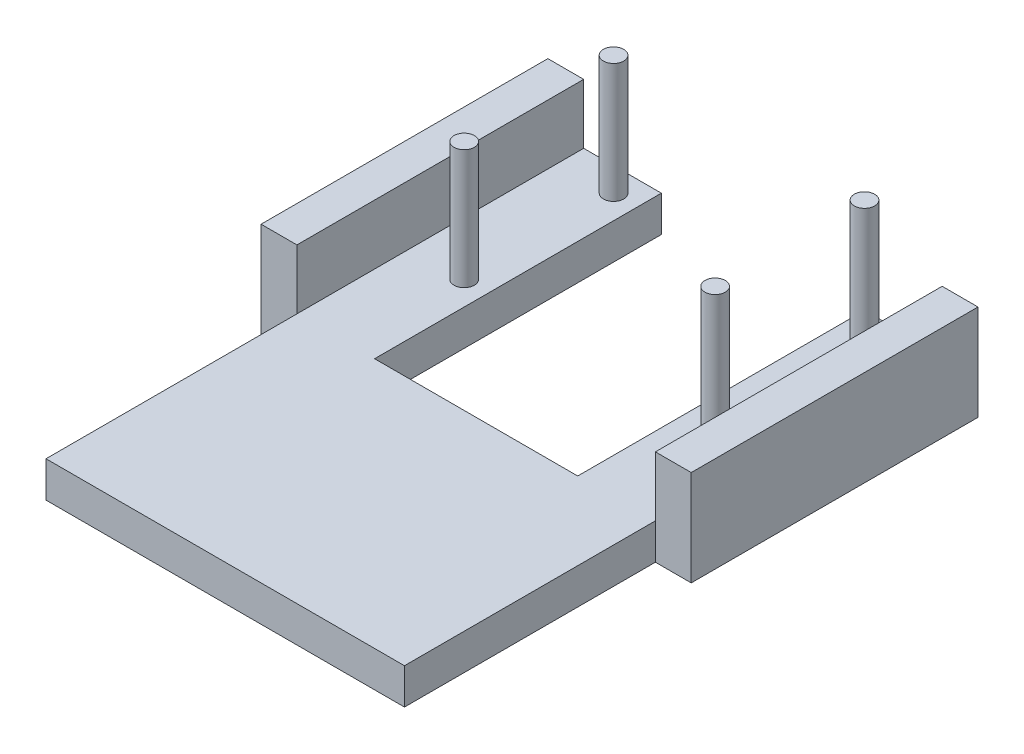
ISO-10303-21;
HEADER;
FILE_DESCRIPTION(('STEP AP214'),'2;1');
FILE_NAME('part.step','',(''),(''),'','','');
FILE_SCHEMA(('AUTOMOTIVE_DESIGN { 1 0 10303 214 1 1 1 1 }'));
ENDSEC;
DATA;
#1=APPLICATION_CONTEXT('core data for automotive mechanical design processes');
#2=APPLICATION_PROTOCOL_DEFINITION('international standard','automotive_design',2000,#1);
#3=PRODUCT_CONTEXT('',#1,'mechanical');
#4=PRODUCT('Part','Part','',(#3));
#5=PRODUCT_RELATED_PRODUCT_CATEGORY('part','',(#4));
#6=PRODUCT_DEFINITION_FORMATION('','',#4);
#7=PRODUCT_DEFINITION_CONTEXT('part definition',#1,'design');
#8=PRODUCT_DEFINITION('design','',#6,#7);
#9=PRODUCT_DEFINITION_SHAPE('','',#8);
#10=(LENGTH_UNIT() NAMED_UNIT(*) SI_UNIT(.MILLI.,.METRE.));
#11=(NAMED_UNIT(*) PLANE_ANGLE_UNIT() SI_UNIT($,.RADIAN.));
#12=(NAMED_UNIT(*) SI_UNIT($,.STERADIAN.) SOLID_ANGLE_UNIT());
#13=UNCERTAINTY_MEASURE_WITH_UNIT(LENGTH_MEASURE(1.E-05),#10,'distance_accuracy_value','');
#14=(GEOMETRIC_REPRESENTATION_CONTEXT(3) GLOBAL_UNCERTAINTY_ASSIGNED_CONTEXT((#13)) GLOBAL_UNIT_ASSIGNED_CONTEXT((#10,
#11,#12)) REPRESENTATION_CONTEXT('',''));
#15=CARTESIAN_POINT('',(0.,0.,0.));
#16=DIRECTION('',(0.,0.,1.));
#17=DIRECTION('',(1.,0.,0.));
#18=AXIS2_PLACEMENT_3D('',#15,#16,#17);
#19=CARTESIAN_POINT('',(0.,3.,0.));
#20=DIRECTION('',(0.,-1.,0.));
#21=DIRECTION('',(0.,0.,-1.));
#22=AXIS2_PLACEMENT_3D('',#19,#20,#21);
#23=PLANE('',#22);
#24=CARTESIAN_POINT('',(4.5,3.,-30.5));
#25=DIRECTION('',(0.,-1.,0.));
#26=DIRECTION('',(0.,0.,-1.));
#27=AXIS2_PLACEMENT_3D('',#24,#25,#26);
#28=CIRCLE('',#27,0.85);
#29=CARTESIAN_POINT('',(4.5,3.,-31.35));
#30=VERTEX_POINT('',#29);
#31=EDGE_CURVE('E11',#30,#30,#28,.F.);
#32=ORIENTED_EDGE('',*,*,#31,.F.);
#33=EDGE_LOOP('',(#32));
#34=FACE_BOUND('',#33,.T.);
#35=CARTESIAN_POINT('',(25.5,3.,-30.5));
#36=DIRECTION('',(0.,-1.,0.));
#37=DIRECTION('',(0.,0.,-1.));
#38=AXIS2_PLACEMENT_3D('',#35,#36,#37);
#39=CIRCLE('',#38,0.85);
#40=CARTESIAN_POINT('',(25.5,3.,-31.35));
#41=VERTEX_POINT('',#40);
#42=EDGE_CURVE('E41',#41,#41,#39,.F.);
#43=ORIENTED_EDGE('',*,*,#42,.F.);
#44=EDGE_LOOP('',(#43));
#45=FACE_BOUND('',#44,.T.);
#46=CARTESIAN_POINT('',(25.5,3.,-43.));
#47=DIRECTION('',(0.,-1.,0.));
#48=DIRECTION('',(0.,0.,-1.));
#49=AXIS2_PLACEMENT_3D('',#46,#47,#48);
#50=CIRCLE('',#49,0.850000000000001);
#51=CARTESIAN_POINT('',(25.5,3.,-43.85));
#52=VERTEX_POINT('',#51);
#53=EDGE_CURVE('E205',#52,#52,#50,.F.);
#54=ORIENTED_EDGE('',*,*,#53,.F.);
#55=EDGE_LOOP('',(#54));
#56=FACE_BOUND('',#55,.T.);
#57=CARTESIAN_POINT('',(4.5,3.,-43.));
#58=DIRECTION('',(0.,-1.,0.));
#59=DIRECTION('',(0.,0.,-1.));
#60=AXIS2_PLACEMENT_3D('',#57,#58,#59);
#61=CIRCLE('',#60,0.850000000000002);
#62=CARTESIAN_POINT('',(4.5,3.,-43.85));
#63=VERTEX_POINT('',#62);
#64=EDGE_CURVE('E202',#63,#63,#61,.F.);
#65=ORIENTED_EDGE('',*,*,#64,.F.);
#66=EDGE_LOOP('',(#65));
#67=FACE_BOUND('',#66,.T.);
#68=DIRECTION('',(0.,0.,1.));
#69=VECTOR('',#68,1.);
#70=CARTESIAN_POINT('',(30.,3.,-45.));
#71=LINE('',#70,#69);
#72=CARTESIAN_POINT('',(30.,3.,-45.));
#73=VERTEX_POINT('',#72);
#74=CARTESIAN_POINT('',(30.,3.,-21.));
#75=VERTEX_POINT('',#74);
#76=EDGE_CURVE('E231',#73,#75,#71,.T.);
#77=ORIENTED_EDGE('',*,*,#76,.F.);
#78=DIRECTION('',(-1.,0.,0.));
#79=VECTOR('',#78,1.);
#80=CARTESIAN_POINT('',(23.5,3.,-45.));
#81=LINE('',#80,#79);
#82=CARTESIAN_POINT('',(23.5,3.,-45.));
#83=VERTEX_POINT('',#82);
#84=EDGE_CURVE('E281',#73,#83,#81,.T.);
#85=ORIENTED_EDGE('',*,*,#84,.T.);
#86=DIRECTION('',(0.,0.,1.));
#87=VECTOR('',#86,1.);
#88=CARTESIAN_POINT('',(23.5,3.,-21.));
#89=LINE('',#88,#87);
#90=CARTESIAN_POINT('',(23.5,3.,-21.));
#91=VERTEX_POINT('',#90);
#92=EDGE_CURVE('E130',#83,#91,#89,.T.);
#93=ORIENTED_EDGE('',*,*,#92,.T.);
#94=DIRECTION('',(-1.,0.,0.));
#95=VECTOR('',#94,1.);
#96=CARTESIAN_POINT('',(6.5,3.,-21.));
#97=LINE('',#96,#95);
#98=CARTESIAN_POINT('',(6.5,3.,-21.));
#99=VERTEX_POINT('',#98);
#100=EDGE_CURVE('E123',#91,#99,#97,.T.);
#101=ORIENTED_EDGE('',*,*,#100,.T.);
#102=DIRECTION('',(0.,0.,-1.));
#103=VECTOR('',#102,1.);
#104=CARTESIAN_POINT('',(6.5,3.,-45.));
#105=LINE('',#104,#103);
#106=CARTESIAN_POINT('',(6.5,3.,-45.));
#107=VERTEX_POINT('',#106);
#108=EDGE_CURVE('E127',#99,#107,#105,.T.);
#109=ORIENTED_EDGE('',*,*,#108,.T.);
#110=DIRECTION('',(-1.,0.,0.));
#111=VECTOR('',#110,1.);
#112=CARTESIAN_POINT('',(-3.,3.,-45.));
#113=LINE('',#112,#111);
#114=CARTESIAN_POINT('',(0.,3.,-45.));
#115=VERTEX_POINT('',#114);
#116=EDGE_CURVE('E148',#107,#115,#113,.T.);
#117=ORIENTED_EDGE('',*,*,#116,.T.);
#118=DIRECTION('',(0.,0.,-1.));
#119=VECTOR('',#118,1.);
#120=CARTESIAN_POINT('',(0.,3.,-21.));
#121=LINE('',#120,#119);
#122=CARTESIAN_POINT('',(0.,3.,-21.));
#123=VERTEX_POINT('',#122);
#124=EDGE_CURVE('E49',#123,#115,#121,.T.);
#125=ORIENTED_EDGE('',*,*,#124,.F.);
#126=DIRECTION('',(0.,0.,1.));
#127=VECTOR('',#126,1.);
#128=CARTESIAN_POINT('',(0.,3.,-21.));
#129=LINE('',#128,#127);
#130=CARTESIAN_POINT('',(0.,3.,0.));
#131=VERTEX_POINT('',#130);
#132=EDGE_CURVE('E177',#123,#131,#129,.T.);
#133=ORIENTED_EDGE('',*,*,#132,.T.);
#134=DIRECTION('',(1.,0.,0.));
#135=VECTOR('',#134,1.);
#136=CARTESIAN_POINT('',(30.,3.,0.));
#137=LINE('',#136,#135);
#138=CARTESIAN_POINT('',(30.,3.,0.));
#139=VERTEX_POINT('',#138);
#140=EDGE_CURVE('E107',#131,#139,#137,.T.);
#141=ORIENTED_EDGE('',*,*,#140,.T.);
#142=DIRECTION('',(0.,0.,-1.));
#143=VECTOR('',#142,1.);
#144=CARTESIAN_POINT('',(30.,3.,0.));
#145=LINE('',#144,#143);
#146=EDGE_CURVE('E279',#139,#75,#145,.T.);
#147=ORIENTED_EDGE('',*,*,#146,.T.);
#148=EDGE_LOOP('',(#77,#85,#93,#101,#109,#117,#125,#133,#141,#147));
#149=FACE_BOUND('',#148,.T.);
#150=ADVANCED_FACE('F32',(#34,#45,#56,#67,#149),#23,.F.);
#151=CARTESIAN_POINT('',(0.,3.,-21.));
#152=DIRECTION('',(1.,0.,0.));
#153=DIRECTION('',(0.,0.,-1.));
#154=AXIS2_PLACEMENT_3D('',#151,#152,#153);
#155=PLANE('',#154);
#156=DIRECTION('',(0.,0.,1.));
#157=VECTOR('',#156,1.);
#158=CARTESIAN_POINT('',(0.,0.,-21.));
#159=LINE('',#158,#157);
#160=CARTESIAN_POINT('',(0.,0.,-21.));
#161=VERTEX_POINT('',#160);
#162=CARTESIAN_POINT('',(0.,0.,0.));
#163=VERTEX_POINT('',#162);
#164=EDGE_CURVE('E154',#161,#163,#159,.T.);
#165=ORIENTED_EDGE('',*,*,#164,.T.);
#166=DIRECTION('',(0.,-1.,0.));
#167=VECTOR('',#166,1.);
#168=CARTESIAN_POINT('',(0.,3.,0.));
#169=LINE('',#168,#167);
#170=EDGE_CURVE('E200',#131,#163,#169,.T.);
#171=ORIENTED_EDGE('',*,*,#170,.F.);
#172=ORIENTED_EDGE('',*,*,#132,.F.);
#173=DIRECTION('',(0.,-1.,0.));
#174=VECTOR('',#173,1.);
#175=CARTESIAN_POINT('',(0.,3.,-21.));
#176=LINE('',#175,#174);
#177=EDGE_CURVE('E150',#123,#161,#176,.T.);
#178=ORIENTED_EDGE('',*,*,#177,.T.);
#179=EDGE_LOOP('',(#165,#171,#172,#178));
#180=FACE_BOUND('',#179,.T.);
#181=ADVANCED_FACE('F34',(#180),#155,.F.);
#182=CARTESIAN_POINT('',(30.,3.,0.));
#183=DIRECTION('',(0.,0.,-1.));
#184=DIRECTION('',(-1.,0.,0.));
#185=AXIS2_PLACEMENT_3D('',#182,#183,#184);
#186=PLANE('',#185);
#187=DIRECTION('',(1.,0.,0.));
#188=VECTOR('',#187,1.);
#189=CARTESIAN_POINT('',(30.,0.,0.));
#190=LINE('',#189,#188);
#191=CARTESIAN_POINT('',(30.,0.,0.));
#192=VERTEX_POINT('',#191);
#193=EDGE_CURVE('E157',#163,#192,#190,.T.);
#194=ORIENTED_EDGE('',*,*,#193,.T.);
#195=DIRECTION('',(0.,-1.,0.));
#196=VECTOR('',#195,1.);
#197=CARTESIAN_POINT('',(30.,3.,0.));
#198=LINE('',#197,#196);
#199=EDGE_CURVE('E197',#139,#192,#198,.T.);
#200=ORIENTED_EDGE('',*,*,#199,.F.);
#201=ORIENTED_EDGE('',*,*,#140,.F.);
#202=ORIENTED_EDGE('',*,*,#170,.T.);
#203=EDGE_LOOP('',(#194,#200,#201,#202));
#204=FACE_BOUND('',#203,.T.);
#205=ADVANCED_FACE('F326',(#204),#186,.F.);
#206=CARTESIAN_POINT('',(30.,3.,0.));
#207=DIRECTION('',(-1.,0.,0.));
#208=DIRECTION('',(0.,0.,1.));
#209=AXIS2_PLACEMENT_3D('',#206,#207,#208);
#210=PLANE('',#209);
#211=DIRECTION('',(0.,0.,-1.));
#212=VECTOR('',#211,1.);
#213=CARTESIAN_POINT('',(30.,0.,0.));
#214=LINE('',#213,#212);
#215=CARTESIAN_POINT('',(30.,0.,-21.));
#216=VERTEX_POINT('',#215);
#217=EDGE_CURVE('E160',#192,#216,#214,.T.);
#218=ORIENTED_EDGE('',*,*,#217,.T.);
#219=DIRECTION('',(0.,-1.,0.));
#220=VECTOR('',#219,1.);
#221=CARTESIAN_POINT('',(30.,3.,-21.));
#222=LINE('',#221,#220);
#223=EDGE_CURVE('E194',#75,#216,#222,.T.);
#224=ORIENTED_EDGE('',*,*,#223,.F.);
#225=ORIENTED_EDGE('',*,*,#146,.F.);
#226=ORIENTED_EDGE('',*,*,#199,.T.);
#227=EDGE_LOOP('',(#218,#224,#225,#226));
#228=FACE_BOUND('',#227,.T.);
#229=ADVANCED_FACE('F328',(#228),#210,.F.);
#230=CARTESIAN_POINT('',(30.,3.,-21.));
#231=DIRECTION('',(0.,0.,-1.));
#232=DIRECTION('',(-1.,0.,0.));
#233=AXIS2_PLACEMENT_3D('',#230,#231,#232);
#234=PLANE('',#233);
#235=DIRECTION('',(1.,0.,0.));
#236=VECTOR('',#235,1.);
#237=CARTESIAN_POINT('',(30.,0.,-21.));
#238=LINE('',#237,#236);
#239=CARTESIAN_POINT('',(33.,0.,-21.));
#240=VERTEX_POINT('',#239);
#241=EDGE_CURVE('E162',#216,#240,#238,.T.);
#242=ORIENTED_EDGE('',*,*,#241,.T.);
#243=DIRECTION('',(0.,-1.,0.));
#244=VECTOR('',#243,1.);
#245=CARTESIAN_POINT('',(33.,3.,-21.));
#246=LINE('',#245,#244);
#247=CARTESIAN_POINT('',(33.,8.,-21.));
#248=VERTEX_POINT('',#247);
#249=EDGE_CURVE('E191',#248,#240,#246,.T.);
#250=ORIENTED_EDGE('',*,*,#249,.F.);
#251=DIRECTION('',(1.,0.,0.));
#252=VECTOR('',#251,1.);
#253=CARTESIAN_POINT('',(30.,8.,-21.));
#254=LINE('',#253,#252);
#255=CARTESIAN_POINT('',(30.,8.,-21.));
#256=VERTEX_POINT('',#255);
#257=EDGE_CURVE('E250',#256,#248,#254,.T.);
#258=ORIENTED_EDGE('',*,*,#257,.F.);
#259=DIRECTION('',(0.,-1.,0.));
#260=VECTOR('',#259,1.);
#261=CARTESIAN_POINT('',(30.,8.,-21.));
#262=LINE('',#261,#260);
#263=EDGE_CURVE('E252',#256,#75,#262,.T.);
#264=ORIENTED_EDGE('',*,*,#263,.T.);
#265=ORIENTED_EDGE('',*,*,#223,.T.);
#266=EDGE_LOOP('',(#242,#250,#258,#264,#265));
#267=FACE_BOUND('',#266,.T.);
#268=ADVANCED_FACE('F337',(#267),#234,.F.);
#269=CARTESIAN_POINT('',(33.,3.,-21.));
#270=DIRECTION('',(-1.,0.,0.));
#271=DIRECTION('',(0.,0.,1.));
#272=AXIS2_PLACEMENT_3D('',#269,#270,#271);
#273=PLANE('',#272);
#274=DIRECTION('',(0.,0.,-1.));
#275=VECTOR('',#274,1.);
#276=CARTESIAN_POINT('',(33.,0.,-21.));
#277=LINE('',#276,#275);
#278=CARTESIAN_POINT('',(33.,0.,-45.));
#279=VERTEX_POINT('',#278);
#280=EDGE_CURVE('E164',#240,#279,#277,.T.);
#281=ORIENTED_EDGE('',*,*,#280,.T.);
#282=DIRECTION('',(0.,-1.,0.));
#283=VECTOR('',#282,1.);
#284=CARTESIAN_POINT('',(33.,3.,-45.));
#285=LINE('',#284,#283);
#286=CARTESIAN_POINT('',(33.,8.,-45.));
#287=VERTEX_POINT('',#286);
#288=EDGE_CURVE('E188',#287,#279,#285,.T.);
#289=ORIENTED_EDGE('',*,*,#288,.F.);
#290=DIRECTION('',(0.,0.,-1.));
#291=VECTOR('',#290,1.);
#292=CARTESIAN_POINT('',(33.,8.,-21.));
#293=LINE('',#292,#291);
#294=EDGE_CURVE('E235',#248,#287,#293,.T.);
#295=ORIENTED_EDGE('',*,*,#294,.F.);
#296=ORIENTED_EDGE('',*,*,#249,.T.);
#297=EDGE_LOOP('',(#281,#289,#295,#296));
#298=FACE_BOUND('',#297,.T.);
#299=ADVANCED_FACE('F346',(#298),#273,.F.);
#300=CARTESIAN_POINT('',(23.5,3.,-45.));
#301=DIRECTION('',(0.,0.,1.));
#302=DIRECTION('',(1.,0.,0.));
#303=AXIS2_PLACEMENT_3D('',#300,#301,#302);
#304=PLANE('',#303);
#305=DIRECTION('',(-1.,0.,0.));
#306=VECTOR('',#305,1.);
#307=CARTESIAN_POINT('',(23.5,0.,-45.));
#308=LINE('',#307,#306);
#309=CARTESIAN_POINT('',(23.5,0.,-45.));
#310=VERTEX_POINT('',#309);
#311=EDGE_CURVE('E166',#279,#310,#308,.T.);
#312=ORIENTED_EDGE('',*,*,#311,.T.);
#313=DIRECTION('',(0.,-1.,0.));
#314=VECTOR('',#313,1.);
#315=CARTESIAN_POINT('',(23.5,3.,-45.));
#316=LINE('',#315,#314);
#317=EDGE_CURVE('E185',#83,#310,#316,.T.);
#318=ORIENTED_EDGE('',*,*,#317,.F.);
#319=ORIENTED_EDGE('',*,*,#84,.F.);
#320=DIRECTION('',(0.,-1.,0.));
#321=VECTOR('',#320,1.);
#322=CARTESIAN_POINT('',(30.,8.,-45.));
#323=LINE('',#322,#321);
#324=CARTESIAN_POINT('',(30.,8.,-45.));
#325=VERTEX_POINT('',#324);
#326=EDGE_CURVE('E256',#325,#73,#323,.T.);
#327=ORIENTED_EDGE('',*,*,#326,.F.);
#328=DIRECTION('',(-1.,0.,0.));
#329=VECTOR('',#328,1.);
#330=CARTESIAN_POINT('',(33.,8.,-45.));
#331=LINE('',#330,#329);
#332=EDGE_CURVE('E244',#287,#325,#331,.T.);
#333=ORIENTED_EDGE('',*,*,#332,.F.);
#334=ORIENTED_EDGE('',*,*,#288,.T.);
#335=EDGE_LOOP('',(#312,#318,#319,#327,#333,#334));
#336=FACE_BOUND('',#335,.T.);
#337=ADVANCED_FACE('F287',(#336),#304,.F.);
#338=CARTESIAN_POINT('',(23.5,3.,-21.));
#339=DIRECTION('',(1.,0.,0.));
#340=DIRECTION('',(0.,0.,-1.));
#341=AXIS2_PLACEMENT_3D('',#338,#339,#340);
#342=PLANE('',#341);
#343=DIRECTION('',(0.,0.,1.));
#344=VECTOR('',#343,1.);
#345=CARTESIAN_POINT('',(23.5,0.,-21.));
#346=LINE('',#345,#344);
#347=CARTESIAN_POINT('',(23.5,0.,-21.));
#348=VERTEX_POINT('',#347);
#349=EDGE_CURVE('E168',#310,#348,#346,.T.);
#350=ORIENTED_EDGE('',*,*,#349,.T.);
#351=DIRECTION('',(0.,-1.,0.));
#352=VECTOR('',#351,1.);
#353=CARTESIAN_POINT('',(23.5,3.,-21.));
#354=LINE('',#353,#352);
#355=EDGE_CURVE('E142',#91,#348,#354,.T.);
#356=ORIENTED_EDGE('',*,*,#355,.F.);
#357=ORIENTED_EDGE('',*,*,#92,.F.);
#358=ORIENTED_EDGE('',*,*,#317,.T.);
#359=EDGE_LOOP('',(#350,#356,#357,#358));
#360=FACE_BOUND('',#359,.T.);
#361=ADVANCED_FACE('F291',(#360),#342,.F.);
#362=CARTESIAN_POINT('',(6.5,3.,-21.));
#363=DIRECTION('',(0.,0.,1.));
#364=DIRECTION('',(1.,0.,0.));
#365=AXIS2_PLACEMENT_3D('',#362,#363,#364);
#366=PLANE('',#365);
#367=DIRECTION('',(-1.,0.,0.));
#368=VECTOR('',#367,1.);
#369=CARTESIAN_POINT('',(6.5,0.,-21.));
#370=LINE('',#369,#368);
#371=CARTESIAN_POINT('',(6.5,0.,-21.));
#372=VERTEX_POINT('',#371);
#373=EDGE_CURVE('E139',#348,#372,#370,.T.);
#374=ORIENTED_EDGE('',*,*,#373,.T.);
#375=DIRECTION('',(0.,-1.,0.));
#376=VECTOR('',#375,1.);
#377=CARTESIAN_POINT('',(6.5,3.,-21.));
#378=LINE('',#377,#376);
#379=EDGE_CURVE('E136',#99,#372,#378,.T.);
#380=ORIENTED_EDGE('',*,*,#379,.F.);
#381=ORIENTED_EDGE('',*,*,#100,.F.);
#382=ORIENTED_EDGE('',*,*,#355,.T.);
#383=EDGE_LOOP('',(#374,#380,#381,#382));
#384=FACE_BOUND('',#383,.T.);
#385=ADVANCED_FACE('F137',(#384),#366,.F.);
#386=CARTESIAN_POINT('',(6.5,3.,-45.));
#387=DIRECTION('',(-1.,0.,0.));
#388=DIRECTION('',(0.,0.,1.));
#389=AXIS2_PLACEMENT_3D('',#386,#387,#388);
#390=PLANE('',#389);
#391=DIRECTION('',(0.,0.,-1.));
#392=VECTOR('',#391,1.);
#393=CARTESIAN_POINT('',(6.5,0.,-45.));
#394=LINE('',#393,#392);
#395=CARTESIAN_POINT('',(6.5,0.,-45.));
#396=VERTEX_POINT('',#395);
#397=EDGE_CURVE('E171',#372,#396,#394,.T.);
#398=ORIENTED_EDGE('',*,*,#397,.T.);
#399=DIRECTION('',(0.,-1.,0.));
#400=VECTOR('',#399,1.);
#401=CARTESIAN_POINT('',(6.5,3.,-45.));
#402=LINE('',#401,#400);
#403=EDGE_CURVE('E143',#107,#396,#402,.T.);
#404=ORIENTED_EDGE('',*,*,#403,.F.);
#405=ORIENTED_EDGE('',*,*,#108,.F.);
#406=ORIENTED_EDGE('',*,*,#379,.T.);
#407=EDGE_LOOP('',(#398,#404,#405,#406));
#408=FACE_BOUND('',#407,.T.);
#409=ADVANCED_FACE('F145',(#408),#390,.F.);
#410=CARTESIAN_POINT('',(-3.,3.,-45.));
#411=DIRECTION('',(0.,0.,1.));
#412=DIRECTION('',(1.,0.,0.));
#413=AXIS2_PLACEMENT_3D('',#410,#411,#412);
#414=PLANE('',#413);
#415=DIRECTION('',(-1.,0.,0.));
#416=VECTOR('',#415,1.);
#417=CARTESIAN_POINT('',(-3.,0.,-45.));
#418=LINE('',#417,#416);
#419=CARTESIAN_POINT('',(-3.,0.,-45.));
#420=VERTEX_POINT('',#419);
#421=EDGE_CURVE('E173',#396,#420,#418,.T.);
#422=ORIENTED_EDGE('',*,*,#421,.T.);
#423=DIRECTION('',(0.,-1.,0.));
#424=VECTOR('',#423,1.);
#425=CARTESIAN_POINT('',(-3.,3.,-45.));
#426=LINE('',#425,#424);
#427=CARTESIAN_POINT('',(-3.,8.,-45.));
#428=VERTEX_POINT('',#427);
#429=EDGE_CURVE('E181',#428,#420,#426,.T.);
#430=ORIENTED_EDGE('',*,*,#429,.F.);
#431=DIRECTION('',(-1.,0.,0.));
#432=VECTOR('',#431,1.);
#433=CARTESIAN_POINT('',(0.,8.,-45.));
#434=LINE('',#433,#432);
#435=CARTESIAN_POINT('',(0.,8.,-45.));
#436=VERTEX_POINT('',#435);
#437=EDGE_CURVE('E265',#436,#428,#434,.T.);
#438=ORIENTED_EDGE('',*,*,#437,.F.);
#439=DIRECTION('',(0.,-1.,0.));
#440=VECTOR('',#439,1.);
#441=CARTESIAN_POINT('',(0.,8.,-45.));
#442=LINE('',#441,#440);
#443=EDGE_CURVE('E271',#436,#115,#442,.T.);
#444=ORIENTED_EDGE('',*,*,#443,.T.);
#445=ORIENTED_EDGE('',*,*,#116,.F.);
#446=ORIENTED_EDGE('',*,*,#403,.T.);
#447=EDGE_LOOP('',(#422,#430,#438,#444,#445,#446));
#448=FACE_BOUND('',#447,.T.);
#449=ADVANCED_FACE('F297',(#448),#414,.F.);
#450=CARTESIAN_POINT('',(-3.,3.,-45.));
#451=DIRECTION('',(1.,0.,0.));
#452=DIRECTION('',(0.,0.,-1.));
#453=AXIS2_PLACEMENT_3D('',#450,#451,#452);
#454=PLANE('',#453);
#455=DIRECTION('',(0.,0.,1.));
#456=VECTOR('',#455,1.);
#457=CARTESIAN_POINT('',(-3.,0.,-45.));
#458=LINE('',#457,#456);
#459=CARTESIAN_POINT('',(-3.,0.,-21.));
#460=VERTEX_POINT('',#459);
#461=EDGE_CURVE('E92',#420,#460,#458,.T.);
#462=ORIENTED_EDGE('',*,*,#461,.T.);
#463=DIRECTION('',(0.,-1.,0.));
#464=VECTOR('',#463,1.);
#465=CARTESIAN_POINT('',(-3.,3.,-21.));
#466=LINE('',#465,#464);
#467=CARTESIAN_POINT('',(-3.,8.,-21.));
#468=VERTEX_POINT('',#467);
#469=EDGE_CURVE('E179',#468,#460,#466,.T.);
#470=ORIENTED_EDGE('',*,*,#469,.F.);
#471=DIRECTION('',(0.,0.,1.));
#472=VECTOR('',#471,1.);
#473=CARTESIAN_POINT('',(-3.,8.,-45.));
#474=LINE('',#473,#472);
#475=EDGE_CURVE('E268',#428,#468,#474,.T.);
#476=ORIENTED_EDGE('',*,*,#475,.F.);
#477=ORIENTED_EDGE('',*,*,#429,.T.);
#478=EDGE_LOOP('',(#462,#470,#476,#477));
#479=FACE_BOUND('',#478,.T.);
#480=ADVANCED_FACE('F318',(#479),#454,.F.);
#481=CARTESIAN_POINT('',(-3.,3.,-21.));
#482=DIRECTION('',(0.,0.,-1.));
#483=DIRECTION('',(-1.,0.,0.));
#484=AXIS2_PLACEMENT_3D('',#481,#482,#483);
#485=PLANE('',#484);
#486=DIRECTION('',(1.,0.,0.));
#487=VECTOR('',#486,1.);
#488=CARTESIAN_POINT('',(-3.,0.,-21.));
#489=LINE('',#488,#487);
#490=EDGE_CURVE('E98',#460,#161,#489,.T.);
#491=ORIENTED_EDGE('',*,*,#490,.T.);
#492=ORIENTED_EDGE('',*,*,#177,.F.);
#493=DIRECTION('',(0.,-1.,0.));
#494=VECTOR('',#493,1.);
#495=CARTESIAN_POINT('',(0.,8.,-21.));
#496=LINE('',#495,#494);
#497=CARTESIAN_POINT('',(0.,8.,-21.));
#498=VERTEX_POINT('',#497);
#499=EDGE_CURVE('E158',#498,#123,#496,.T.);
#500=ORIENTED_EDGE('',*,*,#499,.F.);
#501=DIRECTION('',(1.,0.,0.));
#502=VECTOR('',#501,1.);
#503=CARTESIAN_POINT('',(-3.,8.,-21.));
#504=LINE('',#503,#502);
#505=EDGE_CURVE('E259',#468,#498,#504,.T.);
#506=ORIENTED_EDGE('',*,*,#505,.F.);
#507=ORIENTED_EDGE('',*,*,#469,.T.);
#508=EDGE_LOOP('',(#491,#492,#500,#506,#507));
#509=FACE_BOUND('',#508,.T.);
#510=ADVANCED_FACE('F309',(#509),#485,.F.);
#511=CARTESIAN_POINT('',(0.,0.,0.));
#512=DIRECTION('',(0.,-1.,0.));
#513=DIRECTION('',(0.,0.,-1.));
#514=AXIS2_PLACEMENT_3D('',#511,#512,#513);
#515=PLANE('',#514);
#516=ORIENTED_EDGE('',*,*,#164,.F.);
#517=ORIENTED_EDGE('',*,*,#490,.F.);
#518=ORIENTED_EDGE('',*,*,#461,.F.);
#519=ORIENTED_EDGE('',*,*,#421,.F.);
#520=ORIENTED_EDGE('',*,*,#397,.F.);
#521=ORIENTED_EDGE('',*,*,#373,.F.);
#522=ORIENTED_EDGE('',*,*,#349,.F.);
#523=ORIENTED_EDGE('',*,*,#311,.F.);
#524=ORIENTED_EDGE('',*,*,#280,.F.);
#525=ORIENTED_EDGE('',*,*,#241,.F.);
#526=ORIENTED_EDGE('',*,*,#217,.F.);
#527=ORIENTED_EDGE('',*,*,#193,.F.);
#528=EDGE_LOOP('',(#516,#517,#518,#519,#520,#521,#522,#523,#524,#525,#526,#527));
#529=FACE_BOUND('',#528,.T.);
#530=ADVANCED_FACE('F294',(#529),#515,.T.);
#531=CARTESIAN_POINT('',(0.,8.,-21.));
#532=DIRECTION('',(-1.,0.,0.));
#533=DIRECTION('',(0.,0.,1.));
#534=AXIS2_PLACEMENT_3D('',#531,#532,#533);
#535=PLANE('',#534);
#536=ORIENTED_EDGE('',*,*,#124,.T.);
#537=ORIENTED_EDGE('',*,*,#443,.F.);
#538=DIRECTION('',(0.,0.,-1.));
#539=VECTOR('',#538,1.);
#540=CARTESIAN_POINT('',(0.,8.,-21.));
#541=LINE('',#540,#539);
#542=EDGE_CURVE('E262',#498,#436,#541,.T.);
#543=ORIENTED_EDGE('',*,*,#542,.F.);
#544=ORIENTED_EDGE('',*,*,#499,.T.);
#545=EDGE_LOOP('',(#536,#537,#543,#544));
#546=FACE_BOUND('',#545,.T.);
#547=ADVANCED_FACE('F304',(#546),#535,.F.);
#548=CARTESIAN_POINT('',(0.,8.,0.));
#549=DIRECTION('',(0.,1.,0.));
#550=DIRECTION('',(0.,0.,1.));
#551=AXIS2_PLACEMENT_3D('',#548,#549,#550);
#552=PLANE('',#551);
#553=ORIENTED_EDGE('',*,*,#505,.T.);
#554=ORIENTED_EDGE('',*,*,#542,.T.);
#555=ORIENTED_EDGE('',*,*,#437,.T.);
#556=ORIENTED_EDGE('',*,*,#475,.T.);
#557=EDGE_LOOP('',(#553,#554,#555,#556));
#558=FACE_BOUND('',#557,.T.);
#559=ADVANCED_FACE('F320',(#558),#552,.T.);
#560=CARTESIAN_POINT('',(30.,8.,-45.));
#561=DIRECTION('',(1.,0.,0.));
#562=DIRECTION('',(0.,0.,-1.));
#563=AXIS2_PLACEMENT_3D('',#560,#561,#562);
#564=PLANE('',#563);
#565=ORIENTED_EDGE('',*,*,#76,.T.);
#566=ORIENTED_EDGE('',*,*,#263,.F.);
#567=DIRECTION('',(0.,0.,1.));
#568=VECTOR('',#567,1.);
#569=CARTESIAN_POINT('',(30.,8.,-45.));
#570=LINE('',#569,#568);
#571=EDGE_CURVE('E247',#325,#256,#570,.T.);
#572=ORIENTED_EDGE('',*,*,#571,.F.);
#573=ORIENTED_EDGE('',*,*,#326,.T.);
#574=EDGE_LOOP('',(#565,#566,#572,#573));
#575=FACE_BOUND('',#574,.T.);
#576=ADVANCED_FACE('F333',(#575),#564,.F.);
#577=CARTESIAN_POINT('',(0.,8.,0.));
#578=DIRECTION('',(0.,1.,0.));
#579=DIRECTION('',(0.,0.,1.));
#580=AXIS2_PLACEMENT_3D('',#577,#578,#579);
#581=PLANE('',#580);
#582=ORIENTED_EDGE('',*,*,#294,.T.);
#583=ORIENTED_EDGE('',*,*,#332,.T.);
#584=ORIENTED_EDGE('',*,*,#571,.T.);
#585=ORIENTED_EDGE('',*,*,#257,.T.);
#586=EDGE_LOOP('',(#582,#583,#584,#585));
#587=FACE_BOUND('',#586,.T.);
#588=ADVANCED_FACE('F225',(#587),#581,.T.);
#589=CARTESIAN_POINT('',(4.5,8.,-43.));
#590=DIRECTION('',(0.,-1.,0.));
#591=DIRECTION('',(0.,0.,-1.));
#592=AXIS2_PLACEMENT_3D('',#589,#590,#591);
#593=CYLINDRICAL_SURFACE('',#592,0.850000000000002);
#594=ORIENTED_EDGE('',*,*,#64,.T.);
#595=EDGE_LOOP('',(#594));
#596=FACE_BOUND('',#595,.T.);
#597=CARTESIAN_POINT('',(4.5,13.,-43.));
#598=DIRECTION('',(0.,1.,0.));
#599=DIRECTION('',(0.,0.,1.));
#600=AXIS2_PLACEMENT_3D('',#597,#598,#599);
#601=CIRCLE('',#600,0.850000000000002);
#602=CARTESIAN_POINT('',(4.5,13.,-42.15));
#603=VERTEX_POINT('',#602);
#604=EDGE_CURVE('E229',#603,#603,#601,.T.);
#605=ORIENTED_EDGE('',*,*,#604,.F.);
#606=EDGE_LOOP('',(#605));
#607=FACE_BOUND('',#606,.T.);
#608=ADVANCED_FACE('F221',(#596,#607),#593,.T.);
#609=CARTESIAN_POINT('',(25.5,8.,-43.));
#610=DIRECTION('',(0.,-1.,0.));
#611=DIRECTION('',(0.,0.,-1.));
#612=AXIS2_PLACEMENT_3D('',#609,#610,#611);
#613=CYLINDRICAL_SURFACE('',#612,0.850000000000001);
#614=ORIENTED_EDGE('',*,*,#53,.T.);
#615=EDGE_LOOP('',(#614));
#616=FACE_BOUND('',#615,.T.);
#617=CARTESIAN_POINT('',(25.5,13.,-43.));
#618=DIRECTION('',(0.,1.,0.));
#619=DIRECTION('',(0.,0.,1.));
#620=AXIS2_PLACEMENT_3D('',#617,#618,#619);
#621=CIRCLE('',#620,0.850000000000001);
#622=CARTESIAN_POINT('',(25.5,13.,-42.15));
#623=VERTEX_POINT('',#622);
#624=EDGE_CURVE('E232',#623,#623,#621,.T.);
#625=ORIENTED_EDGE('',*,*,#624,.F.);
#626=EDGE_LOOP('',(#625));
#627=FACE_BOUND('',#626,.T.);
#628=ADVANCED_FACE('F224',(#616,#627),#613,.T.);
#629=CARTESIAN_POINT('',(25.5,8.,-30.5));
#630=DIRECTION('',(0.,-1.,0.));
#631=DIRECTION('',(0.,0.,-1.));
#632=AXIS2_PLACEMENT_3D('',#629,#630,#631);
#633=CYLINDRICAL_SURFACE('',#632,0.85);
#634=ORIENTED_EDGE('',*,*,#42,.T.);
#635=EDGE_LOOP('',(#634));
#636=FACE_BOUND('',#635,.T.);
#637=CARTESIAN_POINT('',(25.5,13.,-30.5));
#638=DIRECTION('',(0.,1.,0.));
#639=DIRECTION('',(0.,0.,1.));
#640=AXIS2_PLACEMENT_3D('',#637,#638,#639);
#641=CIRCLE('',#640,0.85);
#642=CARTESIAN_POINT('',(25.5,13.,-29.65));
#643=VERTEX_POINT('',#642);
#644=EDGE_CURVE('E238',#643,#643,#641,.T.);
#645=ORIENTED_EDGE('',*,*,#644,.F.);
#646=EDGE_LOOP('',(#645));
#647=FACE_BOUND('',#646,.T.);
#648=ADVANCED_FACE('F210',(#636,#647),#633,.T.);
#649=CARTESIAN_POINT('',(4.5,8.,-30.5));
#650=DIRECTION('',(0.,-1.,0.));
#651=DIRECTION('',(0.,0.,-1.));
#652=AXIS2_PLACEMENT_3D('',#649,#650,#651);
#653=CYLINDRICAL_SURFACE('',#652,0.85);
#654=ORIENTED_EDGE('',*,*,#31,.T.);
#655=EDGE_LOOP('',(#654));
#656=FACE_BOUND('',#655,.T.);
#657=CARTESIAN_POINT('',(4.5,13.,-30.5));
#658=DIRECTION('',(0.,1.,0.));
#659=DIRECTION('',(0.,0.,1.));
#660=AXIS2_PLACEMENT_3D('',#657,#658,#659);
#661=CIRCLE('',#660,0.85);
#662=CARTESIAN_POINT('',(4.5,13.,-29.65));
#663=VERTEX_POINT('',#662);
#664=EDGE_CURVE('E587',#663,#663,#661,.T.);
#665=ORIENTED_EDGE('',*,*,#664,.F.);
#666=EDGE_LOOP('',(#665));
#667=FACE_BOUND('',#666,.T.);
#668=ADVANCED_FACE('F520',(#656,#667),#653,.T.);
#669=CARTESIAN_POINT('',(4.5,13.,-43.));
#670=DIRECTION('',(0.,1.,0.));
#671=DIRECTION('',(0.,0.,1.));
#672=AXIS2_PLACEMENT_3D('',#669,#670,#671);
#673=PLANE('',#672);
#674=ORIENTED_EDGE('',*,*,#604,.T.);
#675=EDGE_LOOP('',(#674));
#676=FACE_BOUND('',#675,.T.);
#677=ADVANCED_FACE('F529',(#676),#673,.T.);
#678=CARTESIAN_POINT('',(25.5,13.,-43.));
#679=DIRECTION('',(0.,1.,0.));
#680=DIRECTION('',(0.,0.,1.));
#681=AXIS2_PLACEMENT_3D('',#678,#679,#680);
#682=PLANE('',#681);
#683=ORIENTED_EDGE('',*,*,#624,.T.);
#684=EDGE_LOOP('',(#683));
#685=FACE_BOUND('',#684,.T.);
#686=ADVANCED_FACE('F542',(#685),#682,.T.);
#687=CARTESIAN_POINT('',(25.5,13.,-30.5));
#688=DIRECTION('',(0.,1.,0.));
#689=DIRECTION('',(0.,0.,1.));
#690=AXIS2_PLACEMENT_3D('',#687,#688,#689);
#691=PLANE('',#690);
#692=ORIENTED_EDGE('',*,*,#644,.T.);
#693=EDGE_LOOP('',(#692));
#694=FACE_BOUND('',#693,.T.);
#695=ADVANCED_FACE('F550',(#694),#691,.T.);
#696=CARTESIAN_POINT('',(4.5,13.,-30.5));
#697=DIRECTION('',(0.,1.,0.));
#698=DIRECTION('',(0.,0.,1.));
#699=AXIS2_PLACEMENT_3D('',#696,#697,#698);
#700=PLANE('',#699);
#701=ORIENTED_EDGE('',*,*,#664,.T.);
#702=EDGE_LOOP('',(#701));
#703=FACE_BOUND('',#702,.T.);
#704=ADVANCED_FACE('F559',(#703),#700,.T.);
#705=CLOSED_SHELL('',(#150,#181,#205,#229,#268,#299,#337,#361,#385,#409,#449,#480,#510,#530,
#547,#559,#576,#588,#608,#628,#648,#668,#677,#686,#695,#704));
#706=MANIFOLD_SOLID_BREP('B2',#705);
#707=ADVANCED_BREP_SHAPE_REPRESENTATION('',(#18,#706),#14);
#708=SHAPE_DEFINITION_REPRESENTATION(#9,#707);
ENDSEC;
END-ISO-10303-21;
